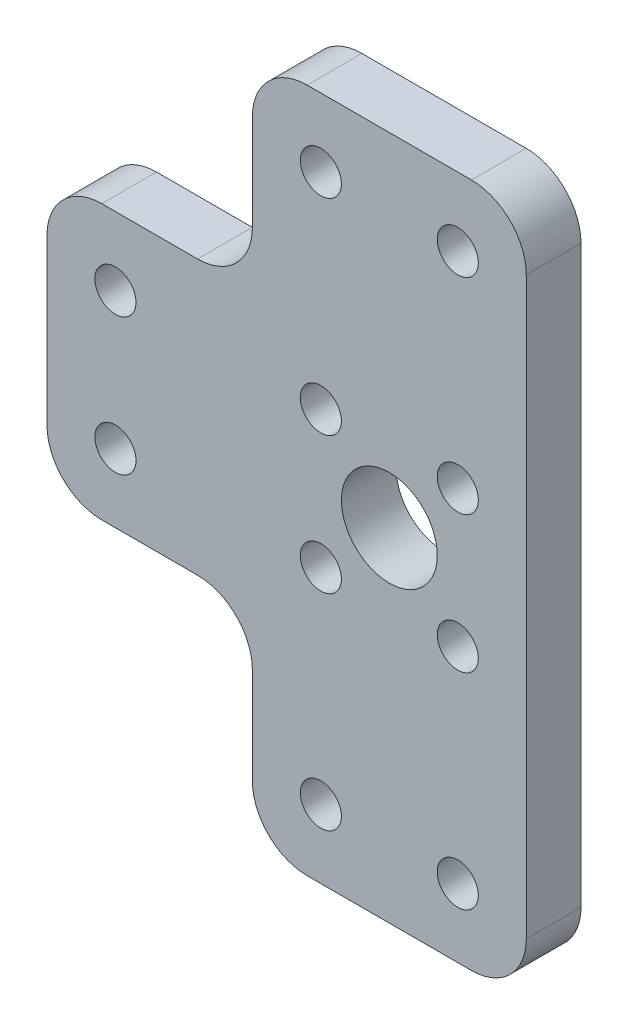
ISO-10303-21;
HEADER;
FILE_DESCRIPTION(('STEP AP214'),'2;1');
FILE_NAME('part.step','',(''),(''),'','','');
FILE_SCHEMA(('AUTOMOTIVE_DESIGN { 1 0 10303 214 1 1 1 1 }'));
ENDSEC;
DATA;
#1=APPLICATION_CONTEXT('core data for automotive mechanical design processes');
#2=APPLICATION_PROTOCOL_DEFINITION('international standard','automotive_design',2000,#1);
#3=PRODUCT_CONTEXT('',#1,'mechanical');
#4=PRODUCT('Part','Part','',(#3));
#5=PRODUCT_RELATED_PRODUCT_CATEGORY('part','',(#4));
#6=PRODUCT_DEFINITION_FORMATION('','',#4);
#7=PRODUCT_DEFINITION_CONTEXT('part definition',#1,'design');
#8=PRODUCT_DEFINITION('design','',#6,#7);
#9=PRODUCT_DEFINITION_SHAPE('','',#8);
#10=(LENGTH_UNIT() NAMED_UNIT(*) SI_UNIT(.MILLI.,.METRE.));
#11=(NAMED_UNIT(*) PLANE_ANGLE_UNIT() SI_UNIT($,.RADIAN.));
#12=(NAMED_UNIT(*) SI_UNIT($,.STERADIAN.) SOLID_ANGLE_UNIT());
#13=UNCERTAINTY_MEASURE_WITH_UNIT(LENGTH_MEASURE(1.E-05),#10,'distance_accuracy_value','');
#14=(GEOMETRIC_REPRESENTATION_CONTEXT(3) GLOBAL_UNCERTAINTY_ASSIGNED_CONTEXT((#13)) GLOBAL_UNIT_ASSIGNED_CONTEXT((#10,
#11,#12)) REPRESENTATION_CONTEXT('',''));
#15=CARTESIAN_POINT('',(0.,0.,0.));
#16=DIRECTION('',(0.,0.,1.));
#17=DIRECTION('',(1.,0.,0.));
#18=AXIS2_PLACEMENT_3D('',#15,#16,#17);
#19=CARTESIAN_POINT('',(0.,-10.,4.));
#20=DIRECTION('',(0.,1.,0.));
#21=DIRECTION('',(-1.,0.,0.));
#22=AXIS2_PLACEMENT_3D('',#19,#20,#21);
#23=PLANE('',#22);
#24=DIRECTION('',(1.,0.,0.));
#25=VECTOR('',#24,1.);
#26=CARTESIAN_POINT('',(0.,-10.,4.));
#27=LINE('',#26,#25);
#28=CARTESIAN_POINT('',(-21.,-10.,4.));
#29=VERTEX_POINT('',#28);
#30=CARTESIAN_POINT('',(-14.,-10.,4.));
#31=VERTEX_POINT('',#30);
#32=EDGE_CURVE('E175',#29,#31,#27,.T.);
#33=ORIENTED_EDGE('',*,*,#32,.F.);
#34=DIRECTION('',(0.,0.,-1.));
#35=VECTOR('',#34,1.);
#36=CARTESIAN_POINT('',(-21.,-10.,4.));
#37=LINE('',#36,#35);
#38=CARTESIAN_POINT('',(-21.,-10.,0.));
#39=VERTEX_POINT('',#38);
#40=EDGE_CURVE('E160',#29,#39,#37,.T.);
#41=ORIENTED_EDGE('',*,*,#40,.T.);
#42=DIRECTION('',(1.,0.,0.));
#43=VECTOR('',#42,1.);
#44=CARTESIAN_POINT('',(0.,-10.,0.));
#45=LINE('',#44,#43);
#46=CARTESIAN_POINT('',(-14.,-10.,0.));
#47=VERTEX_POINT('',#46);
#48=EDGE_CURVE('E172',#39,#47,#45,.T.);
#49=ORIENTED_EDGE('',*,*,#48,.T.);
#50=DIRECTION('',(0.,0.,-1.));
#51=VECTOR('',#50,1.);
#52=CARTESIAN_POINT('',(-14.,-10.,4.));
#53=LINE('',#52,#51);
#54=EDGE_CURVE('E177',#47,#31,#53,.F.);
#55=ORIENTED_EDGE('',*,*,#54,.T.);
#56=EDGE_LOOP('',(#33,#41,#49,#55));
#57=FACE_BOUND('',#56,.T.);
#58=ADVANCED_FACE('F43',(#57),#23,.F.);
#59=CARTESIAN_POINT('',(-9.99999999999999,0.,4.));
#60=DIRECTION('',(1.,0.,0.));
#61=DIRECTION('',(0.,1.,0.));
#62=AXIS2_PLACEMENT_3D('',#59,#60,#61);
#63=PLANE('',#62);
#64=DIRECTION('',(0.,-1.,0.));
#65=VECTOR('',#64,1.);
#66=CARTESIAN_POINT('',(-9.99999999999999,0.,0.));
#67=LINE('',#66,#65);
#68=CARTESIAN_POINT('',(-9.99999999999999,-14.,0.));
#69=VERTEX_POINT('',#68);
#70=CARTESIAN_POINT('',(-9.99999999999999,-21.,0.));
#71=VERTEX_POINT('',#70);
#72=EDGE_CURVE('E183',#69,#71,#67,.T.);
#73=ORIENTED_EDGE('',*,*,#72,.T.);
#74=DIRECTION('',(0.,0.,-1.));
#75=VECTOR('',#74,1.);
#76=CARTESIAN_POINT('',(-9.99999999999999,-21.,4.));
#77=LINE('',#76,#75);
#78=CARTESIAN_POINT('',(-9.99999999999999,-21.,4.));
#79=VERTEX_POINT('',#78);
#80=EDGE_CURVE('E290',#71,#79,#77,.F.);
#81=ORIENTED_EDGE('',*,*,#80,.T.);
#82=DIRECTION('',(0.,-1.,0.));
#83=VECTOR('',#82,1.);
#84=CARTESIAN_POINT('',(-9.99999999999999,0.,4.));
#85=LINE('',#84,#83);
#86=CARTESIAN_POINT('',(-9.99999999999999,-14.,4.));
#87=VERTEX_POINT('',#86);
#88=EDGE_CURVE('E512',#87,#79,#85,.T.);
#89=ORIENTED_EDGE('',*,*,#88,.F.);
#90=DIRECTION('',(0.,0.,-1.));
#91=VECTOR('',#90,1.);
#92=CARTESIAN_POINT('',(-9.99999999999999,-14.,0.));
#93=LINE('',#92,#91);
#94=EDGE_CURVE('E287',#87,#69,#93,.T.);
#95=ORIENTED_EDGE('',*,*,#94,.T.);
#96=EDGE_LOOP('',(#73,#81,#89,#95));
#97=FACE_BOUND('',#96,.T.);
#98=ADVANCED_FACE('F363',(#97),#63,.F.);
#99=CARTESIAN_POINT('',(0.,-25.,4.));
#100=DIRECTION('',(0.,1.,0.));
#101=DIRECTION('',(0.,0.,1.));
#102=AXIS2_PLACEMENT_3D('',#99,#100,#101);
#103=PLANE('',#102);
#104=DIRECTION('',(1.,0.,0.));
#105=VECTOR('',#104,1.);
#106=CARTESIAN_POINT('',(0.,-25.,0.));
#107=LINE('',#106,#105);
#108=CARTESIAN_POINT('',(-5.99999999999999,-25.,0.));
#109=VERTEX_POINT('',#108);
#110=CARTESIAN_POINT('',(6.00000000000001,-25.,0.));
#111=VERTEX_POINT('',#110);
#112=EDGE_CURVE('E187',#109,#111,#107,.T.);
#113=ORIENTED_EDGE('',*,*,#112,.T.);
#114=DIRECTION('',(0.,0.,-1.));
#115=VECTOR('',#114,1.);
#116=CARTESIAN_POINT('',(6.00000000000001,-25.,4.));
#117=LINE('',#116,#115);
#118=CARTESIAN_POINT('',(6.00000000000001,-25.,4.));
#119=VERTEX_POINT('',#118);
#120=EDGE_CURVE('E285',#111,#119,#117,.F.);
#121=ORIENTED_EDGE('',*,*,#120,.T.);
#122=DIRECTION('',(1.,0.,0.));
#123=VECTOR('',#122,1.);
#124=CARTESIAN_POINT('',(0.,-25.,4.));
#125=LINE('',#124,#123);
#126=CARTESIAN_POINT('',(-5.99999999999999,-25.,4.));
#127=VERTEX_POINT('',#126);
#128=EDGE_CURVE('E515',#127,#119,#125,.T.);
#129=ORIENTED_EDGE('',*,*,#128,.F.);
#130=DIRECTION('',(0.,0.,-1.));
#131=VECTOR('',#130,1.);
#132=CARTESIAN_POINT('',(-5.99999999999999,-25.,4.));
#133=LINE('',#132,#131);
#134=EDGE_CURVE('E282',#127,#109,#133,.T.);
#135=ORIENTED_EDGE('',*,*,#134,.T.);
#136=EDGE_LOOP('',(#113,#121,#129,#135));
#137=FACE_BOUND('',#136,.T.);
#138=ADVANCED_FACE('F368',(#137),#103,.F.);
#139=CARTESIAN_POINT('',(10.,0.,4.));
#140=DIRECTION('',(1.,0.,0.));
#141=DIRECTION('',(0.,1.,0.));
#142=AXIS2_PLACEMENT_3D('',#139,#140,#141);
#143=PLANE('',#142);
#144=DIRECTION('',(0.,-1.,0.));
#145=VECTOR('',#144,1.);
#146=CARTESIAN_POINT('',(10.,0.,0.));
#147=LINE('',#146,#145);
#148=CARTESIAN_POINT('',(10.,21.,0.));
#149=VERTEX_POINT('',#148);
#150=CARTESIAN_POINT('',(10.,-21.,0.));
#151=VERTEX_POINT('',#150);
#152=EDGE_CURVE('E196',#149,#151,#147,.T.);
#153=ORIENTED_EDGE('',*,*,#152,.F.);
#154=DIRECTION('',(0.,0.,-1.));
#155=VECTOR('',#154,1.);
#156=CARTESIAN_POINT('',(10.,21.,4.));
#157=LINE('',#156,#155);
#158=CARTESIAN_POINT('',(10.,21.,4.));
#159=VERTEX_POINT('',#158);
#160=EDGE_CURVE('E280',#149,#159,#157,.F.);
#161=ORIENTED_EDGE('',*,*,#160,.T.);
#162=DIRECTION('',(0.,-1.,0.));
#163=VECTOR('',#162,1.);
#164=CARTESIAN_POINT('',(10.,0.,4.));
#165=LINE('',#164,#163);
#166=CARTESIAN_POINT('',(10.,-21.,4.));
#167=VERTEX_POINT('',#166);
#168=EDGE_CURVE('E518',#159,#167,#165,.T.);
#169=ORIENTED_EDGE('',*,*,#168,.T.);
#170=DIRECTION('',(0.,0.,-1.));
#171=VECTOR('',#170,1.);
#172=CARTESIAN_POINT('',(10.,-21.,0.));
#173=LINE('',#172,#171);
#174=EDGE_CURVE('E277',#167,#151,#173,.T.);
#175=ORIENTED_EDGE('',*,*,#174,.T.);
#176=EDGE_LOOP('',(#153,#161,#169,#175));
#177=FACE_BOUND('',#176,.T.);
#178=ADVANCED_FACE('F374',(#177),#143,.T.);
#179=CARTESIAN_POINT('',(0.,25.,4.));
#180=DIRECTION('',(0.,1.,0.));
#181=DIRECTION('',(0.,0.,1.));
#182=AXIS2_PLACEMENT_3D('',#179,#180,#181);
#183=PLANE('',#182);
#184=DIRECTION('',(1.,0.,0.));
#185=VECTOR('',#184,1.);
#186=CARTESIAN_POINT('',(0.,25.,0.));
#187=LINE('',#186,#185);
#188=CARTESIAN_POINT('',(-5.99999999999999,25.,0.));
#189=VERTEX_POINT('',#188);
#190=CARTESIAN_POINT('',(6.00000000000001,25.,0.));
#191=VERTEX_POINT('',#190);
#192=EDGE_CURVE('E199',#189,#191,#187,.T.);
#193=ORIENTED_EDGE('',*,*,#192,.F.);
#194=DIRECTION('',(0.,0.,-1.));
#195=VECTOR('',#194,1.);
#196=CARTESIAN_POINT('',(-5.99999999999999,25.,4.));
#197=LINE('',#196,#195);
#198=CARTESIAN_POINT('',(-5.99999999999999,25.,4.));
#199=VERTEX_POINT('',#198);
#200=EDGE_CURVE('E275',#189,#199,#197,.F.);
#201=ORIENTED_EDGE('',*,*,#200,.T.);
#202=DIRECTION('',(1.,0.,0.));
#203=VECTOR('',#202,1.);
#204=CARTESIAN_POINT('',(0.,25.,4.));
#205=LINE('',#204,#203);
#206=CARTESIAN_POINT('',(6.00000000000001,25.,4.));
#207=VERTEX_POINT('',#206);
#208=EDGE_CURVE('E311',#199,#207,#205,.T.);
#209=ORIENTED_EDGE('',*,*,#208,.T.);
#210=DIRECTION('',(0.,0.,-1.));
#211=VECTOR('',#210,1.);
#212=CARTESIAN_POINT('',(6.00000000000001,25.,4.));
#213=LINE('',#212,#211);
#214=EDGE_CURVE('E272',#207,#191,#213,.T.);
#215=ORIENTED_EDGE('',*,*,#214,.T.);
#216=EDGE_LOOP('',(#193,#201,#209,#215));
#217=FACE_BOUND('',#216,.T.);
#218=ADVANCED_FACE('F378',(#217),#183,.T.);
#219=CARTESIAN_POINT('',(-9.99999999999999,0.,4.));
#220=DIRECTION('',(1.,0.,0.));
#221=DIRECTION('',(0.,1.,0.));
#222=AXIS2_PLACEMENT_3D('',#219,#220,#221);
#223=PLANE('',#222);
#224=DIRECTION('',(0.,-1.,0.));
#225=VECTOR('',#224,1.);
#226=CARTESIAN_POINT('',(-9.99999999999999,0.,4.));
#227=LINE('',#226,#225);
#228=CARTESIAN_POINT('',(-9.99999999999999,21.,4.));
#229=VERTEX_POINT('',#228);
#230=CARTESIAN_POINT('',(-9.99999999999999,14.,4.));
#231=VERTEX_POINT('',#230);
#232=EDGE_CURVE('E306',#229,#231,#227,.T.);
#233=ORIENTED_EDGE('',*,*,#232,.F.);
#234=DIRECTION('',(0.,0.,-1.));
#235=VECTOR('',#234,1.);
#236=CARTESIAN_POINT('',(-9.99999999999999,21.,0.));
#237=LINE('',#236,#235);
#238=CARTESIAN_POINT('',(-9.99999999999999,21.,0.));
#239=VERTEX_POINT('',#238);
#240=EDGE_CURVE('E269',#229,#239,#237,.T.);
#241=ORIENTED_EDGE('',*,*,#240,.T.);
#242=DIRECTION('',(0.,-1.,0.));
#243=VECTOR('',#242,1.);
#244=CARTESIAN_POINT('',(-9.99999999999999,0.,0.));
#245=LINE('',#244,#243);
#246=CARTESIAN_POINT('',(-9.99999999999999,14.,0.));
#247=VERTEX_POINT('',#246);
#248=EDGE_CURVE('E202',#239,#247,#245,.T.);
#249=ORIENTED_EDGE('',*,*,#248,.T.);
#250=DIRECTION('',(0.,0.,-1.));
#251=VECTOR('',#250,1.);
#252=CARTESIAN_POINT('',(-9.99999999999999,14.,4.));
#253=LINE('',#252,#251);
#254=EDGE_CURVE('E267',#247,#231,#253,.F.);
#255=ORIENTED_EDGE('',*,*,#254,.T.);
#256=EDGE_LOOP('',(#233,#241,#249,#255));
#257=FACE_BOUND('',#256,.T.);
#258=ADVANCED_FACE('F300',(#257),#223,.F.);
#259=CARTESIAN_POINT('',(0.,10.,4.));
#260=DIRECTION('',(0.,1.,0.));
#261=DIRECTION('',(0.,0.,1.));
#262=AXIS2_PLACEMENT_3D('',#259,#260,#261);
#263=PLANE('',#262);
#264=DIRECTION('',(1.,0.,0.));
#265=VECTOR('',#264,1.);
#266=CARTESIAN_POINT('',(0.,10.,0.));
#267=LINE('',#266,#265);
#268=CARTESIAN_POINT('',(-21.,10.,0.));
#269=VERTEX_POINT('',#268);
#270=CARTESIAN_POINT('',(-14.,10.,0.));
#271=VERTEX_POINT('',#270);
#272=EDGE_CURVE('E205',#269,#271,#267,.T.);
#273=ORIENTED_EDGE('',*,*,#272,.F.);
#274=DIRECTION('',(0.,0.,-1.));
#275=VECTOR('',#274,1.);
#276=CARTESIAN_POINT('',(-21.,10.,4.));
#277=LINE('',#276,#275);
#278=CARTESIAN_POINT('',(-21.,10.,4.));
#279=VERTEX_POINT('',#278);
#280=EDGE_CURVE('E63',#269,#279,#277,.F.);
#281=ORIENTED_EDGE('',*,*,#280,.T.);
#282=DIRECTION('',(1.,0.,0.));
#283=VECTOR('',#282,1.);
#284=CARTESIAN_POINT('',(0.,10.,4.));
#285=LINE('',#284,#283);
#286=CARTESIAN_POINT('',(-14.,10.,4.));
#287=VERTEX_POINT('',#286);
#288=EDGE_CURVE('E303',#279,#287,#285,.T.);
#289=ORIENTED_EDGE('',*,*,#288,.T.);
#290=DIRECTION('',(0.,0.,-1.));
#291=VECTOR('',#290,1.);
#292=CARTESIAN_POINT('',(-14.,10.,4.));
#293=LINE('',#292,#291);
#294=EDGE_CURVE('E263',#287,#271,#293,.T.);
#295=ORIENTED_EDGE('',*,*,#294,.T.);
#296=EDGE_LOOP('',(#273,#281,#289,#295));
#297=FACE_BOUND('',#296,.T.);
#298=ADVANCED_FACE('F302',(#297),#263,.T.);
#299=CARTESIAN_POINT('',(-5.00000000000013,20.,4.));
#300=DIRECTION('',(0.,0.,-1.));
#301=DIRECTION('',(-1.,0.,0.));
#302=AXIS2_PLACEMENT_3D('',#299,#300,#301);
#303=CYLINDRICAL_SURFACE('',#302,1.5);
#304=CARTESIAN_POINT('',(-5.00000000000013,20.,4.));
#305=DIRECTION('',(0.,0.,1.));
#306=DIRECTION('',(1.,0.,0.));
#307=AXIS2_PLACEMENT_3D('',#304,#305,#306);
#308=CIRCLE('',#307,1.5);
#309=CARTESIAN_POINT('',(-3.50000000000013,20.,4.));
#310=VERTEX_POINT('',#309);
#311=EDGE_CURVE('E335',#310,#310,#308,.T.);
#312=ORIENTED_EDGE('',*,*,#311,.T.);
#313=EDGE_LOOP('',(#312));
#314=FACE_BOUND('',#313,.T.);
#315=CARTESIAN_POINT('',(-5.00000000000013,20.,0.));
#316=DIRECTION('',(0.,0.,1.));
#317=DIRECTION('',(1.,0.,0.));
#318=AXIS2_PLACEMENT_3D('',#315,#316,#317);
#319=CIRCLE('',#318,1.5);
#320=CARTESIAN_POINT('',(-3.50000000000013,20.,0.));
#321=VERTEX_POINT('',#320);
#322=EDGE_CURVE('E231',#321,#321,#319,.T.);
#323=ORIENTED_EDGE('',*,*,#322,.F.);
#324=EDGE_LOOP('',(#323));
#325=FACE_BOUND('',#324,.T.);
#326=ADVANCED_FACE('F387',(#314,#325),#303,.F.);
#327=CARTESIAN_POINT('',(-4.99999999999999,-20.,4.));
#328=DIRECTION('',(0.,0.,-1.));
#329=DIRECTION('',(-1.,0.,0.));
#330=AXIS2_PLACEMENT_3D('',#327,#328,#329);
#331=CYLINDRICAL_SURFACE('',#330,1.5);
#332=CARTESIAN_POINT('',(-4.99999999999999,-20.,4.));
#333=DIRECTION('',(0.,0.,1.));
#334=DIRECTION('',(1.,0.,0.));
#335=AXIS2_PLACEMENT_3D('',#332,#333,#334);
#336=CIRCLE('',#335,1.5);
#337=CARTESIAN_POINT('',(-3.49999999999999,-20.,4.));
#338=VERTEX_POINT('',#337);
#339=EDGE_CURVE('E332',#338,#338,#336,.T.);
#340=ORIENTED_EDGE('',*,*,#339,.T.);
#341=EDGE_LOOP('',(#340));
#342=FACE_BOUND('',#341,.T.);
#343=CARTESIAN_POINT('',(-4.99999999999999,-20.,0.));
#344=DIRECTION('',(0.,0.,1.));
#345=DIRECTION('',(1.,0.,0.));
#346=AXIS2_PLACEMENT_3D('',#343,#344,#345);
#347=CIRCLE('',#346,1.5);
#348=CARTESIAN_POINT('',(-3.49999999999999,-20.,0.));
#349=VERTEX_POINT('',#348);
#350=EDGE_CURVE('E228',#349,#349,#347,.T.);
#351=ORIENTED_EDGE('',*,*,#350,.F.);
#352=EDGE_LOOP('',(#351));
#353=FACE_BOUND('',#352,.T.);
#354=ADVANCED_FACE('F414',(#342,#353),#331,.F.);
#355=CARTESIAN_POINT('',(5.00000000000001,-20.,4.));
#356=DIRECTION('',(0.,0.,-1.));
#357=DIRECTION('',(-1.,0.,0.));
#358=AXIS2_PLACEMENT_3D('',#355,#356,#357);
#359=CYLINDRICAL_SURFACE('',#358,1.5);
#360=CARTESIAN_POINT('',(5.00000000000001,-20.,4.));
#361=DIRECTION('',(0.,0.,1.));
#362=DIRECTION('',(1.,0.,0.));
#363=AXIS2_PLACEMENT_3D('',#360,#361,#362);
#364=CIRCLE('',#363,1.5);
#365=CARTESIAN_POINT('',(6.50000000000001,-20.,4.));
#366=VERTEX_POINT('',#365);
#367=EDGE_CURVE('E329',#366,#366,#364,.T.);
#368=ORIENTED_EDGE('',*,*,#367,.T.);
#369=EDGE_LOOP('',(#368));
#370=FACE_BOUND('',#369,.T.);
#371=CARTESIAN_POINT('',(5.00000000000001,-20.,0.));
#372=DIRECTION('',(0.,0.,1.));
#373=DIRECTION('',(1.,0.,0.));
#374=AXIS2_PLACEMENT_3D('',#371,#372,#373);
#375=CIRCLE('',#374,1.5);
#376=CARTESIAN_POINT('',(6.50000000000001,-20.,0.));
#377=VERTEX_POINT('',#376);
#378=EDGE_CURVE('E225',#377,#377,#375,.T.);
#379=ORIENTED_EDGE('',*,*,#378,.F.);
#380=EDGE_LOOP('',(#379));
#381=FACE_BOUND('',#380,.T.);
#382=ADVANCED_FACE('F410',(#370,#381),#359,.F.);
#383=CARTESIAN_POINT('',(0.,0.,4.));
#384=DIRECTION('',(0.,0.,-1.));
#385=DIRECTION('',(-1.,0.,0.));
#386=AXIS2_PLACEMENT_3D('',#383,#384,#385);
#387=CYLINDRICAL_SURFACE('',#386,3.5);
#388=CARTESIAN_POINT('',(0.,0.,4.));
#389=DIRECTION('',(0.,0.,1.));
#390=DIRECTION('',(1.,0.,0.));
#391=AXIS2_PLACEMENT_3D('',#388,#389,#390);
#392=CIRCLE('',#391,3.5);
#393=CARTESIAN_POINT('',(3.49999999999998,0.,4.));
#394=VERTEX_POINT('',#393);
#395=EDGE_CURVE('E326',#394,#394,#392,.T.);
#396=ORIENTED_EDGE('',*,*,#395,.T.);
#397=EDGE_LOOP('',(#396));
#398=FACE_BOUND('',#397,.T.);
#399=CARTESIAN_POINT('',(0.,0.,0.));
#400=DIRECTION('',(0.,0.,1.));
#401=DIRECTION('',(1.,0.,0.));
#402=AXIS2_PLACEMENT_3D('',#399,#400,#401);
#403=CIRCLE('',#402,3.5);
#404=CARTESIAN_POINT('',(3.49999999999998,0.,0.));
#405=VERTEX_POINT('',#404);
#406=EDGE_CURVE('E222',#405,#405,#403,.T.);
#407=ORIENTED_EDGE('',*,*,#406,.F.);
#408=EDGE_LOOP('',(#407));
#409=FACE_BOUND('',#408,.T.);
#410=ADVANCED_FACE('F406',(#398,#409),#387,.F.);
#411=CARTESIAN_POINT('',(-4.99999999999999,-5.,4.));
#412=DIRECTION('',(0.,0.,-1.));
#413=DIRECTION('',(-1.,0.,0.));
#414=AXIS2_PLACEMENT_3D('',#411,#412,#413);
#415=CYLINDRICAL_SURFACE('',#414,1.5);
#416=CARTESIAN_POINT('',(-4.99999999999999,-5.,4.));
#417=DIRECTION('',(0.,0.,1.));
#418=DIRECTION('',(1.,0.,0.));
#419=AXIS2_PLACEMENT_3D('',#416,#417,#418);
#420=CIRCLE('',#419,1.5);
#421=CARTESIAN_POINT('',(-3.49999999999999,-5.,4.));
#422=VERTEX_POINT('',#421);
#423=EDGE_CURVE('E323',#422,#422,#420,.T.);
#424=ORIENTED_EDGE('',*,*,#423,.T.);
#425=EDGE_LOOP('',(#424));
#426=FACE_BOUND('',#425,.T.);
#427=CARTESIAN_POINT('',(-4.99999999999999,-5.,0.));
#428=DIRECTION('',(0.,0.,1.));
#429=DIRECTION('',(1.,0.,0.));
#430=AXIS2_PLACEMENT_3D('',#427,#428,#429);
#431=CIRCLE('',#430,1.5);
#432=CARTESIAN_POINT('',(-3.49999999999999,-5.,0.));
#433=VERTEX_POINT('',#432);
#434=EDGE_CURVE('E219',#433,#433,#431,.T.);
#435=ORIENTED_EDGE('',*,*,#434,.F.);
#436=EDGE_LOOP('',(#435));
#437=FACE_BOUND('',#436,.T.);
#438=ADVANCED_FACE('F402',(#426,#437),#415,.F.);
#439=CARTESIAN_POINT('',(5.00000000000001,-5.,4.));
#440=DIRECTION('',(0.,0.,-1.));
#441=DIRECTION('',(-1.,0.,0.));
#442=AXIS2_PLACEMENT_3D('',#439,#440,#441);
#443=CYLINDRICAL_SURFACE('',#442,1.5);
#444=CARTESIAN_POINT('',(5.00000000000001,-5.,4.));
#445=DIRECTION('',(0.,0.,1.));
#446=DIRECTION('',(1.,0.,0.));
#447=AXIS2_PLACEMENT_3D('',#444,#445,#446);
#448=CIRCLE('',#447,1.5);
#449=CARTESIAN_POINT('',(6.50000000000001,-5.,4.));
#450=VERTEX_POINT('',#449);
#451=EDGE_CURVE('E320',#450,#450,#448,.T.);
#452=ORIENTED_EDGE('',*,*,#451,.T.);
#453=EDGE_LOOP('',(#452));
#454=FACE_BOUND('',#453,.T.);
#455=CARTESIAN_POINT('',(5.00000000000001,-5.,0.));
#456=DIRECTION('',(0.,0.,1.));
#457=DIRECTION('',(1.,0.,0.));
#458=AXIS2_PLACEMENT_3D('',#455,#456,#457);
#459=CIRCLE('',#458,1.5);
#460=CARTESIAN_POINT('',(6.50000000000001,-5.,0.));
#461=VERTEX_POINT('',#460);
#462=EDGE_CURVE('E216',#461,#461,#459,.T.);
#463=ORIENTED_EDGE('',*,*,#462,.F.);
#464=EDGE_LOOP('',(#463));
#465=FACE_BOUND('',#464,.T.);
#466=ADVANCED_FACE('F398',(#454,#465),#443,.F.);
#467=CARTESIAN_POINT('',(4.99999999999998,5.,4.));
#468=DIRECTION('',(0.,0.,-1.));
#469=DIRECTION('',(-1.,0.,0.));
#470=AXIS2_PLACEMENT_3D('',#467,#468,#469);
#471=CYLINDRICAL_SURFACE('',#470,1.5);
#472=CARTESIAN_POINT('',(4.99999999999998,5.,4.));
#473=DIRECTION('',(0.,0.,1.));
#474=DIRECTION('',(1.,0.,0.));
#475=AXIS2_PLACEMENT_3D('',#472,#473,#474);
#476=CIRCLE('',#475,1.5);
#477=CARTESIAN_POINT('',(6.49999999999997,5.,4.));
#478=VERTEX_POINT('',#477);
#479=EDGE_CURVE('E317',#478,#478,#476,.T.);
#480=ORIENTED_EDGE('',*,*,#479,.T.);
#481=EDGE_LOOP('',(#480));
#482=FACE_BOUND('',#481,.T.);
#483=CARTESIAN_POINT('',(4.99999999999998,5.,0.));
#484=DIRECTION('',(0.,0.,1.));
#485=DIRECTION('',(1.,0.,0.));
#486=AXIS2_PLACEMENT_3D('',#483,#484,#485);
#487=CIRCLE('',#486,1.5);
#488=CARTESIAN_POINT('',(6.49999999999997,5.,0.));
#489=VERTEX_POINT('',#488);
#490=EDGE_CURVE('E213',#489,#489,#487,.T.);
#491=ORIENTED_EDGE('',*,*,#490,.F.);
#492=EDGE_LOOP('',(#491));
#493=FACE_BOUND('',#492,.T.);
#494=ADVANCED_FACE('F394',(#482,#493),#471,.F.);
#495=CARTESIAN_POINT('',(-5.00000000000002,5.,4.));
#496=DIRECTION('',(0.,0.,-1.));
#497=DIRECTION('',(-1.,0.,0.));
#498=AXIS2_PLACEMENT_3D('',#495,#496,#497);
#499=CYLINDRICAL_SURFACE('',#498,1.5);
#500=CARTESIAN_POINT('',(-5.00000000000002,5.,4.));
#501=DIRECTION('',(0.,0.,1.));
#502=DIRECTION('',(1.,0.,0.));
#503=AXIS2_PLACEMENT_3D('',#500,#501,#502);
#504=CIRCLE('',#503,1.5);
#505=CARTESIAN_POINT('',(-3.50000000000002,5.,4.));
#506=VERTEX_POINT('',#505);
#507=EDGE_CURVE('E309',#506,#506,#504,.T.);
#508=ORIENTED_EDGE('',*,*,#507,.T.);
#509=EDGE_LOOP('',(#508));
#510=FACE_BOUND('',#509,.T.);
#511=CARTESIAN_POINT('',(-5.00000000000002,5.,0.));
#512=DIRECTION('',(0.,0.,1.));
#513=DIRECTION('',(1.,0.,0.));
#514=AXIS2_PLACEMENT_3D('',#511,#512,#513);
#515=CIRCLE('',#514,1.5);
#516=CARTESIAN_POINT('',(-3.50000000000002,5.,0.));
#517=VERTEX_POINT('',#516);
#518=EDGE_CURVE('E210',#517,#517,#515,.T.);
#519=ORIENTED_EDGE('',*,*,#518,.F.);
#520=EDGE_LOOP('',(#519));
#521=FACE_BOUND('',#520,.T.);
#522=ADVANCED_FACE('F390',(#510,#521),#499,.F.);
#523=CARTESIAN_POINT('',(-25.,0.,4.));
#524=DIRECTION('',(1.,0.,0.));
#525=DIRECTION('',(0.,0.,-1.));
#526=AXIS2_PLACEMENT_3D('',#523,#524,#525);
#527=PLANE('',#526);
#528=DIRECTION('',(0.,-1.,0.));
#529=VECTOR('',#528,1.);
#530=CARTESIAN_POINT('',(-25.,0.,0.));
#531=LINE('',#530,#529);
#532=CARTESIAN_POINT('',(-25.,6.,0.));
#533=VERTEX_POINT('',#532);
#534=CARTESIAN_POINT('',(-25.,-6.,0.));
#535=VERTEX_POINT('',#534);
#536=EDGE_CURVE('E208',#533,#535,#531,.T.);
#537=ORIENTED_EDGE('',*,*,#536,.T.);
#538=DIRECTION('',(0.,0.,-1.));
#539=VECTOR('',#538,1.);
#540=CARTESIAN_POINT('',(-25.,-6.,4.));
#541=LINE('',#540,#539);
#542=CARTESIAN_POINT('',(-25.,-6.,4.));
#543=VERTEX_POINT('',#542);
#544=EDGE_CURVE('E161',#535,#543,#541,.F.);
#545=ORIENTED_EDGE('',*,*,#544,.T.);
#546=DIRECTION('',(0.,-1.,0.));
#547=VECTOR('',#546,1.);
#548=CARTESIAN_POINT('',(-25.,0.,4.));
#549=LINE('',#548,#547);
#550=CARTESIAN_POINT('',(-25.,6.,4.));
#551=VERTEX_POINT('',#550);
#552=EDGE_CURVE('E305',#551,#543,#549,.T.);
#553=ORIENTED_EDGE('',*,*,#552,.F.);
#554=DIRECTION('',(0.,0.,-1.));
#555=VECTOR('',#554,1.);
#556=CARTESIAN_POINT('',(-25.,6.,0.));
#557=LINE('',#556,#555);
#558=EDGE_CURVE('E166',#551,#533,#557,.T.);
#559=ORIENTED_EDGE('',*,*,#558,.T.);
#560=EDGE_LOOP('',(#537,#545,#553,#559));
#561=FACE_BOUND('',#560,.T.);
#562=ADVANCED_FACE('F357',(#561),#527,.F.);
#563=CARTESIAN_POINT('',(-20.,5.,4.));
#564=DIRECTION('',(0.,0.,-1.));
#565=DIRECTION('',(-1.,0.,0.));
#566=AXIS2_PLACEMENT_3D('',#563,#564,#565);
#567=CYLINDRICAL_SURFACE('',#566,1.5);
#568=CARTESIAN_POINT('',(-20.,5.,4.));
#569=DIRECTION('',(0.,0.,1.));
#570=DIRECTION('',(1.,0.,0.));
#571=AXIS2_PLACEMENT_3D('',#568,#569,#570);
#572=CIRCLE('',#571,1.5);
#573=CARTESIAN_POINT('',(-18.5,5.,4.));
#574=VERTEX_POINT('',#573);
#575=EDGE_CURVE('E432',#574,#574,#572,.T.);
#576=ORIENTED_EDGE('',*,*,#575,.T.);
#577=EDGE_LOOP('',(#576));
#578=FACE_BOUND('',#577,.T.);
#579=CARTESIAN_POINT('',(-20.,5.,0.));
#580=DIRECTION('',(0.,0.,1.));
#581=DIRECTION('',(1.,0.,0.));
#582=AXIS2_PLACEMENT_3D('',#579,#580,#581);
#583=CIRCLE('',#582,1.5);
#584=CARTESIAN_POINT('',(-18.5,5.,0.));
#585=VERTEX_POINT('',#584);
#586=EDGE_CURVE('E184',#585,#585,#583,.T.);
#587=ORIENTED_EDGE('',*,*,#586,.F.);
#588=EDGE_LOOP('',(#587));
#589=FACE_BOUND('',#588,.T.);
#590=ADVANCED_FACE('F347',(#578,#589),#567,.F.);
#591=CARTESIAN_POINT('',(-20.,-5.,4.));
#592=DIRECTION('',(0.,0.,-1.));
#593=DIRECTION('',(-1.,0.,0.));
#594=AXIS2_PLACEMENT_3D('',#591,#592,#593);
#595=CYLINDRICAL_SURFACE('',#594,1.5);
#596=CARTESIAN_POINT('',(-20.,-5.,4.));
#597=DIRECTION('',(0.,0.,1.));
#598=DIRECTION('',(1.,0.,0.));
#599=AXIS2_PLACEMENT_3D('',#596,#597,#598);
#600=CIRCLE('',#599,1.5);
#601=CARTESIAN_POINT('',(-18.5,-5.,4.));
#602=VERTEX_POINT('',#601);
#603=EDGE_CURVE('E237',#602,#602,#600,.T.);
#604=ORIENTED_EDGE('',*,*,#603,.T.);
#605=EDGE_LOOP('',(#604));
#606=FACE_BOUND('',#605,.T.);
#607=CARTESIAN_POINT('',(-20.,-5.,0.));
#608=DIRECTION('',(0.,0.,1.));
#609=DIRECTION('',(1.,0.,0.));
#610=AXIS2_PLACEMENT_3D('',#607,#608,#609);
#611=CIRCLE('',#610,1.5);
#612=CARTESIAN_POINT('',(-18.5,-5.,0.));
#613=VERTEX_POINT('',#612);
#614=EDGE_CURVE('E190',#613,#613,#611,.T.);
#615=ORIENTED_EDGE('',*,*,#614,.F.);
#616=EDGE_LOOP('',(#615));
#617=FACE_BOUND('',#616,.T.);
#618=ADVANCED_FACE('F344',(#606,#617),#595,.F.);
#619=CARTESIAN_POINT('',(4.99999999999987,20.,4.));
#620=DIRECTION('',(0.,0.,-1.));
#621=DIRECTION('',(-1.,0.,0.));
#622=AXIS2_PLACEMENT_3D('',#619,#620,#621);
#623=CYLINDRICAL_SURFACE('',#622,1.5);
#624=CARTESIAN_POINT('',(4.99999999999987,20.,4.));
#625=DIRECTION('',(0.,0.,1.));
#626=DIRECTION('',(1.,0.,0.));
#627=AXIS2_PLACEMENT_3D('',#624,#625,#626);
#628=CIRCLE('',#627,1.5);
#629=CARTESIAN_POINT('',(6.49999999999987,20.,4.));
#630=VERTEX_POINT('',#629);
#631=EDGE_CURVE('E238',#630,#630,#628,.T.);
#632=ORIENTED_EDGE('',*,*,#631,.T.);
#633=EDGE_LOOP('',(#632));
#634=FACE_BOUND('',#633,.T.);
#635=CARTESIAN_POINT('',(4.99999999999987,20.,0.));
#636=DIRECTION('',(0.,0.,1.));
#637=DIRECTION('',(1.,0.,0.));
#638=AXIS2_PLACEMENT_3D('',#635,#636,#637);
#639=CIRCLE('',#638,1.5);
#640=CARTESIAN_POINT('',(6.49999999999987,20.,0.));
#641=VERTEX_POINT('',#640);
#642=EDGE_CURVE('E234',#641,#641,#639,.T.);
#643=ORIENTED_EDGE('',*,*,#642,.F.);
#644=EDGE_LOOP('',(#643));
#645=FACE_BOUND('',#644,.T.);
#646=ADVANCED_FACE('F346',(#634,#645),#623,.F.);
#647=CARTESIAN_POINT('',(0.,0.,4.));
#648=DIRECTION('',(0.,0.,1.));
#649=DIRECTION('',(1.,0.,0.));
#650=AXIS2_PLACEMENT_3D('',#647,#648,#649);
#651=PLANE('',#650);
#652=ORIENTED_EDGE('',*,*,#603,.F.);
#653=EDGE_LOOP('',(#652));
#654=FACE_BOUND('',#653,.T.);
#655=ORIENTED_EDGE('',*,*,#575,.F.);
#656=EDGE_LOOP('',(#655));
#657=FACE_BOUND('',#656,.T.);
#658=ORIENTED_EDGE('',*,*,#552,.T.);
#659=CARTESIAN_POINT('',(-21.,-6.,4.));
#660=DIRECTION('',(0.,0.,1.));
#661=DIRECTION('',(1.,0.,0.));
#662=AXIS2_PLACEMENT_3D('',#659,#660,#661);
#663=CIRCLE('',#662,4.);
#664=EDGE_CURVE('E261',#543,#29,#663,.T.);
#665=ORIENTED_EDGE('',*,*,#664,.T.);
#666=ORIENTED_EDGE('',*,*,#32,.T.);
#667=CARTESIAN_POINT('',(-14.,-14.,4.));
#668=DIRECTION('',(0.,0.,1.));
#669=DIRECTION('',(1.,0.,0.));
#670=AXIS2_PLACEMENT_3D('',#667,#668,#669);
#671=CIRCLE('',#670,4.);
#672=EDGE_CURVE('E293',#31,#87,#671,.F.);
#673=ORIENTED_EDGE('',*,*,#672,.T.);
#674=ORIENTED_EDGE('',*,*,#88,.T.);
#675=CARTESIAN_POINT('',(-5.99999999999999,-21.,4.));
#676=DIRECTION('',(0.,0.,1.));
#677=DIRECTION('',(1.,0.,0.));
#678=AXIS2_PLACEMENT_3D('',#675,#676,#677);
#679=CIRCLE('',#678,4.);
#680=EDGE_CURVE('E251',#79,#127,#679,.T.);
#681=ORIENTED_EDGE('',*,*,#680,.T.);
#682=ORIENTED_EDGE('',*,*,#128,.T.);
#683=CARTESIAN_POINT('',(6.00000000000001,-21.,4.));
#684=DIRECTION('',(0.,0.,1.));
#685=DIRECTION('',(1.,0.,0.));
#686=AXIS2_PLACEMENT_3D('',#683,#684,#685);
#687=CIRCLE('',#686,4.);
#688=EDGE_CURVE('E253',#119,#167,#687,.T.);
#689=ORIENTED_EDGE('',*,*,#688,.T.);
#690=ORIENTED_EDGE('',*,*,#168,.F.);
#691=CARTESIAN_POINT('',(6.00000000000001,21.,4.));
#692=DIRECTION('',(0.,0.,1.));
#693=DIRECTION('',(1.,0.,0.));
#694=AXIS2_PLACEMENT_3D('',#691,#692,#693);
#695=CIRCLE('',#694,4.);
#696=EDGE_CURVE('E255',#159,#207,#695,.T.);
#697=ORIENTED_EDGE('',*,*,#696,.T.);
#698=ORIENTED_EDGE('',*,*,#208,.F.);
#699=CARTESIAN_POINT('',(-5.99999999999999,21.,4.));
#700=DIRECTION('',(0.,0.,1.));
#701=DIRECTION('',(1.,0.,0.));
#702=AXIS2_PLACEMENT_3D('',#699,#700,#701);
#703=CIRCLE('',#702,4.);
#704=EDGE_CURVE('E257',#199,#229,#703,.T.);
#705=ORIENTED_EDGE('',*,*,#704,.T.);
#706=ORIENTED_EDGE('',*,*,#232,.T.);
#707=CARTESIAN_POINT('',(-14.,14.,4.));
#708=DIRECTION('',(0.,0.,1.));
#709=DIRECTION('',(1.,0.,0.));
#710=AXIS2_PLACEMENT_3D('',#707,#708,#709);
#711=CIRCLE('',#710,4.);
#712=EDGE_CURVE('E11',#231,#287,#711,.F.);
#713=ORIENTED_EDGE('',*,*,#712,.T.);
#714=ORIENTED_EDGE('',*,*,#288,.F.);
#715=CARTESIAN_POINT('',(-21.,6.,4.));
#716=DIRECTION('',(0.,0.,1.));
#717=DIRECTION('',(1.,0.,0.));
#718=AXIS2_PLACEMENT_3D('',#715,#716,#717);
#719=CIRCLE('',#718,4.);
#720=EDGE_CURVE('E259',#279,#551,#719,.T.);
#721=ORIENTED_EDGE('',*,*,#720,.T.);
#722=EDGE_LOOP('',(#658,#665,#666,#673,#674,#681,#682,#689,#690,#697,#698,#705,#706,#713,#714,#721));
#723=FACE_BOUND('',#722,.T.);
#724=ORIENTED_EDGE('',*,*,#507,.F.);
#725=EDGE_LOOP('',(#724));
#726=FACE_BOUND('',#725,.T.);
#727=ORIENTED_EDGE('',*,*,#479,.F.);
#728=EDGE_LOOP('',(#727));
#729=FACE_BOUND('',#728,.T.);
#730=ORIENTED_EDGE('',*,*,#451,.F.);
#731=EDGE_LOOP('',(#730));
#732=FACE_BOUND('',#731,.T.);
#733=ORIENTED_EDGE('',*,*,#423,.F.);
#734=EDGE_LOOP('',(#733));
#735=FACE_BOUND('',#734,.T.);
#736=ORIENTED_EDGE('',*,*,#395,.F.);
#737=EDGE_LOOP('',(#736));
#738=FACE_BOUND('',#737,.T.);
#739=ORIENTED_EDGE('',*,*,#367,.F.);
#740=EDGE_LOOP('',(#739));
#741=FACE_BOUND('',#740,.T.);
#742=ORIENTED_EDGE('',*,*,#339,.F.);
#743=EDGE_LOOP('',(#742));
#744=FACE_BOUND('',#743,.T.);
#745=ORIENTED_EDGE('',*,*,#311,.F.);
#746=EDGE_LOOP('',(#745));
#747=FACE_BOUND('',#746,.T.);
#748=ORIENTED_EDGE('',*,*,#631,.F.);
#749=EDGE_LOOP('',(#748));
#750=FACE_BOUND('',#749,.T.);
#751=ADVANCED_FACE('F354',(#654,#657,#723,#726,#729,#732,#735,#738,#741,#744,#747,#750),#651,.T.);
#752=CARTESIAN_POINT('',(0.,0.,0.));
#753=DIRECTION('',(0.,0.,1.));
#754=DIRECTION('',(1.,0.,0.));
#755=AXIS2_PLACEMENT_3D('',#752,#753,#754);
#756=PLANE('',#755);
#757=ORIENTED_EDGE('',*,*,#614,.T.);
#758=EDGE_LOOP('',(#757));
#759=FACE_BOUND('',#758,.T.);
#760=ORIENTED_EDGE('',*,*,#586,.T.);
#761=EDGE_LOOP('',(#760));
#762=FACE_BOUND('',#761,.T.);
#763=ORIENTED_EDGE('',*,*,#48,.F.);
#764=CARTESIAN_POINT('',(-21.,-6.,0.));
#765=DIRECTION('',(0.,0.,1.));
#766=DIRECTION('',(1.,0.,0.));
#767=AXIS2_PLACEMENT_3D('',#764,#765,#766);
#768=CIRCLE('',#767,4.);
#769=EDGE_CURVE('E156',#39,#535,#768,.F.);
#770=ORIENTED_EDGE('',*,*,#769,.T.);
#771=ORIENTED_EDGE('',*,*,#536,.F.);
#772=CARTESIAN_POINT('',(-21.,6.,0.));
#773=DIRECTION('',(0.,0.,1.));
#774=DIRECTION('',(1.,0.,0.));
#775=AXIS2_PLACEMENT_3D('',#772,#773,#774);
#776=CIRCLE('',#775,4.);
#777=EDGE_CURVE('E167',#533,#269,#776,.F.);
#778=ORIENTED_EDGE('',*,*,#777,.T.);
#779=ORIENTED_EDGE('',*,*,#272,.T.);
#780=CARTESIAN_POINT('',(-14.,14.,0.));
#781=DIRECTION('',(0.,0.,1.));
#782=DIRECTION('',(1.,0.,0.));
#783=AXIS2_PLACEMENT_3D('',#780,#781,#782);
#784=CIRCLE('',#783,4.);
#785=EDGE_CURVE('E51',#271,#247,#784,.T.);
#786=ORIENTED_EDGE('',*,*,#785,.T.);
#787=ORIENTED_EDGE('',*,*,#248,.F.);
#788=CARTESIAN_POINT('',(-5.99999999999999,21.,0.));
#789=DIRECTION('',(0.,0.,1.));
#790=DIRECTION('',(1.,0.,0.));
#791=AXIS2_PLACEMENT_3D('',#788,#789,#790);
#792=CIRCLE('',#791,4.);
#793=EDGE_CURVE('E245',#239,#189,#792,.F.);
#794=ORIENTED_EDGE('',*,*,#793,.T.);
#795=ORIENTED_EDGE('',*,*,#192,.T.);
#796=CARTESIAN_POINT('',(6.00000000000001,21.,0.));
#797=DIRECTION('',(0.,0.,1.));
#798=DIRECTION('',(1.,0.,0.));
#799=AXIS2_PLACEMENT_3D('',#796,#797,#798);
#800=CIRCLE('',#799,4.);
#801=EDGE_CURVE('E243',#191,#149,#800,.F.);
#802=ORIENTED_EDGE('',*,*,#801,.T.);
#803=ORIENTED_EDGE('',*,*,#152,.T.);
#804=CARTESIAN_POINT('',(6.00000000000001,-21.,0.));
#805=DIRECTION('',(0.,0.,1.));
#806=DIRECTION('',(1.,0.,0.));
#807=AXIS2_PLACEMENT_3D('',#804,#805,#806);
#808=CIRCLE('',#807,4.);
#809=EDGE_CURVE('E241',#151,#111,#808,.F.);
#810=ORIENTED_EDGE('',*,*,#809,.T.);
#811=ORIENTED_EDGE('',*,*,#112,.F.);
#812=CARTESIAN_POINT('',(-5.99999999999999,-21.,0.));
#813=DIRECTION('',(0.,0.,1.));
#814=DIRECTION('',(1.,0.,0.));
#815=AXIS2_PLACEMENT_3D('',#812,#813,#814);
#816=CIRCLE('',#815,4.);
#817=EDGE_CURVE('E176',#109,#71,#816,.F.);
#818=ORIENTED_EDGE('',*,*,#817,.T.);
#819=ORIENTED_EDGE('',*,*,#72,.F.);
#820=CARTESIAN_POINT('',(-14.,-14.,0.));
#821=DIRECTION('',(0.,0.,1.));
#822=DIRECTION('',(1.,0.,0.));
#823=AXIS2_PLACEMENT_3D('',#820,#821,#822);
#824=CIRCLE('',#823,4.);
#825=EDGE_CURVE('E182',#69,#47,#824,.T.);
#826=ORIENTED_EDGE('',*,*,#825,.T.);
#827=EDGE_LOOP('',(#763,#770,#771,#778,#779,#786,#787,#794,#795,#802,#803,#810,#811,#818,#819,#826));
#828=FACE_BOUND('',#827,.T.);
#829=ORIENTED_EDGE('',*,*,#518,.T.);
#830=EDGE_LOOP('',(#829));
#831=FACE_BOUND('',#830,.T.);
#832=ORIENTED_EDGE('',*,*,#490,.T.);
#833=EDGE_LOOP('',(#832));
#834=FACE_BOUND('',#833,.T.);
#835=ORIENTED_EDGE('',*,*,#462,.T.);
#836=EDGE_LOOP('',(#835));
#837=FACE_BOUND('',#836,.T.);
#838=ORIENTED_EDGE('',*,*,#434,.T.);
#839=EDGE_LOOP('',(#838));
#840=FACE_BOUND('',#839,.T.);
#841=ORIENTED_EDGE('',*,*,#406,.T.);
#842=EDGE_LOOP('',(#841));
#843=FACE_BOUND('',#842,.T.);
#844=ORIENTED_EDGE('',*,*,#378,.T.);
#845=EDGE_LOOP('',(#844));
#846=FACE_BOUND('',#845,.T.);
#847=ORIENTED_EDGE('',*,*,#350,.T.);
#848=EDGE_LOOP('',(#847));
#849=FACE_BOUND('',#848,.T.);
#850=ORIENTED_EDGE('',*,*,#322,.T.);
#851=EDGE_LOOP('',(#850));
#852=FACE_BOUND('',#851,.T.);
#853=ORIENTED_EDGE('',*,*,#642,.T.);
#854=EDGE_LOOP('',(#853));
#855=FACE_BOUND('',#854,.T.);
#856=ADVANCED_FACE('F179',(#759,#762,#828,#831,#834,#837,#840,#843,#846,#849,#852,#855),#756,.F.);
#857=CARTESIAN_POINT('',(-21.,-6.,4.));
#858=DIRECTION('',(0.,0.,-1.));
#859=DIRECTION('',(-1.,0.,0.));
#860=AXIS2_PLACEMENT_3D('',#857,#858,#859);
#861=CYLINDRICAL_SURFACE('',#860,4.);
#862=ORIENTED_EDGE('',*,*,#664,.F.);
#863=ORIENTED_EDGE('',*,*,#544,.F.);
#864=ORIENTED_EDGE('',*,*,#769,.F.);
#865=ORIENTED_EDGE('',*,*,#40,.F.);
#866=EDGE_LOOP('',(#862,#863,#864,#865));
#867=FACE_BOUND('',#866,.T.);
#868=ADVANCED_FACE('F159',(#867),#861,.T.);
#869=CARTESIAN_POINT('',(-21.,6.,4.));
#870=DIRECTION('',(0.,0.,1.));
#871=DIRECTION('',(1.,0.,0.));
#872=AXIS2_PLACEMENT_3D('',#869,#870,#871);
#873=CYLINDRICAL_SURFACE('',#872,4.);
#874=ORIENTED_EDGE('',*,*,#720,.F.);
#875=ORIENTED_EDGE('',*,*,#280,.F.);
#876=ORIENTED_EDGE('',*,*,#777,.F.);
#877=ORIENTED_EDGE('',*,*,#558,.F.);
#878=EDGE_LOOP('',(#874,#875,#876,#877));
#879=FACE_BOUND('',#878,.T.);
#880=ADVANCED_FACE('F480',(#879),#873,.T.);
#881=CARTESIAN_POINT('',(-5.99999999999999,21.,4.));
#882=DIRECTION('',(0.,0.,1.));
#883=DIRECTION('',(1.,0.,0.));
#884=AXIS2_PLACEMENT_3D('',#881,#882,#883);
#885=CYLINDRICAL_SURFACE('',#884,4.);
#886=ORIENTED_EDGE('',*,*,#704,.F.);
#887=ORIENTED_EDGE('',*,*,#200,.F.);
#888=ORIENTED_EDGE('',*,*,#793,.F.);
#889=ORIENTED_EDGE('',*,*,#240,.F.);
#890=EDGE_LOOP('',(#886,#887,#888,#889));
#891=FACE_BOUND('',#890,.T.);
#892=ADVANCED_FACE('F482',(#891),#885,.T.);
#893=CARTESIAN_POINT('',(6.00000000000001,21.,4.));
#894=DIRECTION('',(0.,0.,-1.));
#895=DIRECTION('',(-1.,0.,0.));
#896=AXIS2_PLACEMENT_3D('',#893,#894,#895);
#897=CYLINDRICAL_SURFACE('',#896,4.);
#898=ORIENTED_EDGE('',*,*,#696,.F.);
#899=ORIENTED_EDGE('',*,*,#160,.F.);
#900=ORIENTED_EDGE('',*,*,#801,.F.);
#901=ORIENTED_EDGE('',*,*,#214,.F.);
#902=EDGE_LOOP('',(#898,#899,#900,#901));
#903=FACE_BOUND('',#902,.T.);
#904=ADVANCED_FACE('F488',(#903),#897,.T.);
#905=CARTESIAN_POINT('',(6.00000000000001,-21.,4.));
#906=DIRECTION('',(0.,0.,1.));
#907=DIRECTION('',(1.,0.,0.));
#908=AXIS2_PLACEMENT_3D('',#905,#906,#907);
#909=CYLINDRICAL_SURFACE('',#908,4.);
#910=ORIENTED_EDGE('',*,*,#688,.F.);
#911=ORIENTED_EDGE('',*,*,#120,.F.);
#912=ORIENTED_EDGE('',*,*,#809,.F.);
#913=ORIENTED_EDGE('',*,*,#174,.F.);
#914=EDGE_LOOP('',(#910,#911,#912,#913));
#915=FACE_BOUND('',#914,.T.);
#916=ADVANCED_FACE('F494',(#915),#909,.T.);
#917=CARTESIAN_POINT('',(-5.99999999999999,-21.,4.));
#918=DIRECTION('',(0.,0.,-1.));
#919=DIRECTION('',(-1.,0.,0.));
#920=AXIS2_PLACEMENT_3D('',#917,#918,#919);
#921=CYLINDRICAL_SURFACE('',#920,4.);
#922=ORIENTED_EDGE('',*,*,#680,.F.);
#923=ORIENTED_EDGE('',*,*,#80,.F.);
#924=ORIENTED_EDGE('',*,*,#817,.F.);
#925=ORIENTED_EDGE('',*,*,#134,.F.);
#926=EDGE_LOOP('',(#922,#923,#924,#925));
#927=FACE_BOUND('',#926,.T.);
#928=ADVANCED_FACE('F498',(#927),#921,.T.);
#929=CARTESIAN_POINT('',(-14.,-14.,4.));
#930=DIRECTION('',(0.,0.,1.));
#931=DIRECTION('',(1.,0.,0.));
#932=AXIS2_PLACEMENT_3D('',#929,#930,#931);
#933=CYLINDRICAL_SURFACE('',#932,4.);
#934=ORIENTED_EDGE('',*,*,#672,.F.);
#935=ORIENTED_EDGE('',*,*,#54,.F.);
#936=ORIENTED_EDGE('',*,*,#825,.F.);
#937=ORIENTED_EDGE('',*,*,#94,.F.);
#938=EDGE_LOOP('',(#934,#935,#936,#937));
#939=FACE_BOUND('',#938,.T.);
#940=ADVANCED_FACE('F501',(#939),#933,.F.);
#941=CARTESIAN_POINT('',(-14.,14.,4.));
#942=DIRECTION('',(0.,0.,-1.));
#943=DIRECTION('',(-1.,0.,0.));
#944=AXIS2_PLACEMENT_3D('',#941,#942,#943);
#945=CYLINDRICAL_SURFACE('',#944,4.);
#946=ORIENTED_EDGE('',*,*,#712,.F.);
#947=ORIENTED_EDGE('',*,*,#254,.F.);
#948=ORIENTED_EDGE('',*,*,#785,.F.);
#949=ORIENTED_EDGE('',*,*,#294,.F.);
#950=EDGE_LOOP('',(#946,#947,#948,#949));
#951=FACE_BOUND('',#950,.T.);
#952=ADVANCED_FACE('F45',(#951),#945,.F.);
#953=CLOSED_SHELL('',(#58,#98,#138,#178,#218,#258,#298,#326,#354,#382,#410,#438,#466,#494,#522,
#562,#590,#618,#646,#751,#856,#868,#880,#892,#904,#916,#928,#940,#952));
#954=MANIFOLD_SOLID_BREP('B2',#953);
#955=ADVANCED_BREP_SHAPE_REPRESENTATION('',(#18,#954),#14);
#956=SHAPE_DEFINITION_REPRESENTATION(#9,#955);
ENDSEC;
END-ISO-10303-21;
